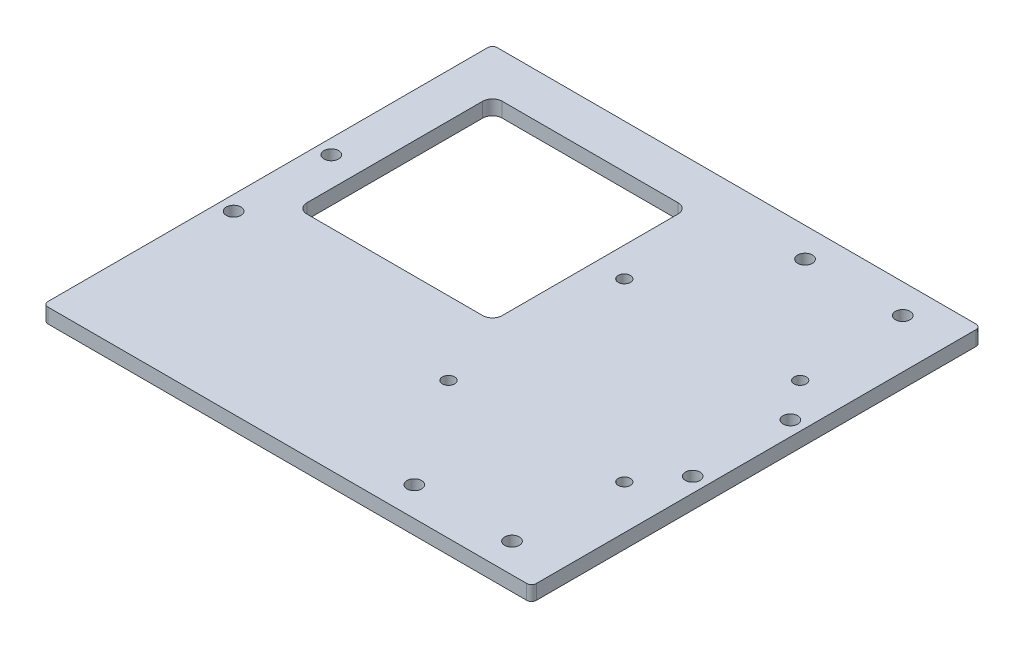
ISO-10303-21;
HEADER;
FILE_DESCRIPTION(('STEP AP214'),'2;1');
FILE_NAME('part.step','',(''),(''),'','','');
FILE_SCHEMA(('AUTOMOTIVE_DESIGN { 1 0 10303 214 1 1 1 1 }'));
ENDSEC;
DATA;
#1=APPLICATION_CONTEXT('core data for automotive mechanical design processes');
#2=APPLICATION_PROTOCOL_DEFINITION('international standard','automotive_design',2000,#1);
#3=PRODUCT_CONTEXT('',#1,'mechanical');
#4=PRODUCT('Part','Part','',(#3));
#5=PRODUCT_RELATED_PRODUCT_CATEGORY('part','',(#4));
#6=PRODUCT_DEFINITION_FORMATION('','',#4);
#7=PRODUCT_DEFINITION_CONTEXT('part definition',#1,'design');
#8=PRODUCT_DEFINITION('design','',#6,#7);
#9=PRODUCT_DEFINITION_SHAPE('','',#8);
#10=(LENGTH_UNIT() NAMED_UNIT(*) SI_UNIT(.MILLI.,.METRE.));
#11=(NAMED_UNIT(*) PLANE_ANGLE_UNIT() SI_UNIT($,.RADIAN.));
#12=(NAMED_UNIT(*) SI_UNIT($,.STERADIAN.) SOLID_ANGLE_UNIT());
#13=UNCERTAINTY_MEASURE_WITH_UNIT(LENGTH_MEASURE(1.E-05),#10,'distance_accuracy_value','');
#14=(GEOMETRIC_REPRESENTATION_CONTEXT(3) GLOBAL_UNCERTAINTY_ASSIGNED_CONTEXT((#13)) GLOBAL_UNIT_ASSIGNED_CONTEXT((#10,
#11,#12)) REPRESENTATION_CONTEXT('',''));
#15=CARTESIAN_POINT('',(0.,0.,0.));
#16=DIRECTION('',(0.,0.,1.));
#17=DIRECTION('',(1.,0.,0.));
#18=AXIS2_PLACEMENT_3D('',#15,#16,#17);
#19=CARTESIAN_POINT('',(0.,3.,0.));
#20=DIRECTION('',(1.,0.,0.));
#21=DIRECTION('',(0.,0.,-1.));
#22=AXIS2_PLACEMENT_3D('',#19,#20,#21);
#23=PLANE('',#22);
#24=DIRECTION('',(0.,0.,1.));
#25=VECTOR('',#24,1.);
#26=CARTESIAN_POINT('',(0.,0.,0.));
#27=LINE('',#26,#25);
#28=CARTESIAN_POINT('',(0.,0.,-91.));
#29=VERTEX_POINT('',#28);
#30=CARTESIAN_POINT('',(0.,0.,-1.));
#31=VERTEX_POINT('',#30);
#32=EDGE_CURVE('E247',#29,#31,#27,.T.);
#33=ORIENTED_EDGE('',*,*,#32,.T.);
#34=DIRECTION('',(0.,-1.,0.));
#35=VECTOR('',#34,1.);
#36=CARTESIAN_POINT('',(0.,3.,-1.));
#37=LINE('',#36,#35);
#38=CARTESIAN_POINT('',(0.,3.,-1.));
#39=VERTEX_POINT('',#38);
#40=EDGE_CURVE('E11',#31,#39,#37,.F.);
#41=ORIENTED_EDGE('',*,*,#40,.T.);
#42=DIRECTION('',(0.,0.,1.));
#43=VECTOR('',#42,1.);
#44=CARTESIAN_POINT('',(0.,3.,0.));
#45=LINE('',#44,#43);
#46=CARTESIAN_POINT('',(0.,3.,-91.));
#47=VERTEX_POINT('',#46);
#48=EDGE_CURVE('E249',#47,#39,#45,.T.);
#49=ORIENTED_EDGE('',*,*,#48,.F.);
#50=DIRECTION('',(0.,-1.,0.));
#51=VECTOR('',#50,1.);
#52=CARTESIAN_POINT('',(0.,3.,-91.));
#53=LINE('',#52,#51);
#54=EDGE_CURVE('E50',#47,#29,#53,.T.);
#55=ORIENTED_EDGE('',*,*,#54,.T.);
#56=EDGE_LOOP('',(#33,#41,#49,#55));
#57=FACE_BOUND('',#56,.T.);
#58=ADVANCED_FACE('F39',(#57),#23,.F.);
#59=CARTESIAN_POINT('',(0.,3.,0.));
#60=DIRECTION('',(0.,0.,-1.));
#61=DIRECTION('',(-1.,0.,0.));
#62=AXIS2_PLACEMENT_3D('',#59,#60,#61);
#63=PLANE('',#62);
#64=DIRECTION('',(1.,0.,0.));
#65=VECTOR('',#64,1.);
#66=CARTESIAN_POINT('',(0.,0.,0.));
#67=LINE('',#66,#65);
#68=CARTESIAN_POINT('',(1.,0.,0.));
#69=VERTEX_POINT('',#68);
#70=CARTESIAN_POINT('',(99.,0.,0.));
#71=VERTEX_POINT('',#70);
#72=EDGE_CURVE('E260',#69,#71,#67,.T.);
#73=ORIENTED_EDGE('',*,*,#72,.T.);
#74=DIRECTION('',(0.,-1.,0.));
#75=VECTOR('',#74,1.);
#76=CARTESIAN_POINT('',(99.,3.,0.));
#77=LINE('',#76,#75);
#78=CARTESIAN_POINT('',(99.,3.,0.));
#79=VERTEX_POINT('',#78);
#80=EDGE_CURVE('E53',#71,#79,#77,.F.);
#81=ORIENTED_EDGE('',*,*,#80,.T.);
#82=DIRECTION('',(1.,0.,0.));
#83=VECTOR('',#82,1.);
#84=CARTESIAN_POINT('',(0.,3.,0.));
#85=LINE('',#84,#83);
#86=CARTESIAN_POINT('',(1.,3.,0.));
#87=VERTEX_POINT('',#86);
#88=EDGE_CURVE('E347',#87,#79,#85,.T.);
#89=ORIENTED_EDGE('',*,*,#88,.F.);
#90=DIRECTION('',(0.,-1.,0.));
#91=VECTOR('',#90,1.);
#92=CARTESIAN_POINT('',(1.,3.,0.));
#93=LINE('',#92,#91);
#94=EDGE_CURVE('E237',#87,#69,#93,.T.);
#95=ORIENTED_EDGE('',*,*,#94,.T.);
#96=EDGE_LOOP('',(#73,#81,#89,#95));
#97=FACE_BOUND('',#96,.T.);
#98=ADVANCED_FACE('F382',(#97),#63,.F.);
#99=CARTESIAN_POINT('',(100.,3.,0.));
#100=DIRECTION('',(-1.,0.,0.));
#101=DIRECTION('',(0.,0.,1.));
#102=AXIS2_PLACEMENT_3D('',#99,#100,#101);
#103=PLANE('',#102);
#104=DIRECTION('',(0.,0.,-1.));
#105=VECTOR('',#104,1.);
#106=CARTESIAN_POINT('',(100.,0.,0.));
#107=LINE('',#106,#105);
#108=CARTESIAN_POINT('',(100.,0.,-1.));
#109=VERTEX_POINT('',#108);
#110=CARTESIAN_POINT('',(100.,0.,-91.));
#111=VERTEX_POINT('',#110);
#112=EDGE_CURVE('E264',#109,#111,#107,.T.);
#113=ORIENTED_EDGE('',*,*,#112,.T.);
#114=DIRECTION('',(0.,-1.,0.));
#115=VECTOR('',#114,1.);
#116=CARTESIAN_POINT('',(100.,3.,-91.));
#117=LINE('',#116,#115);
#118=CARTESIAN_POINT('',(100.,3.,-91.));
#119=VERTEX_POINT('',#118);
#120=EDGE_CURVE('E229',#111,#119,#117,.F.);
#121=ORIENTED_EDGE('',*,*,#120,.T.);
#122=DIRECTION('',(0.,0.,-1.));
#123=VECTOR('',#122,1.);
#124=CARTESIAN_POINT('',(100.,3.,0.));
#125=LINE('',#124,#123);
#126=CARTESIAN_POINT('',(100.,3.,-1.));
#127=VERTEX_POINT('',#126);
#128=EDGE_CURVE('E352',#127,#119,#125,.T.);
#129=ORIENTED_EDGE('',*,*,#128,.F.);
#130=DIRECTION('',(0.,-1.,0.));
#131=VECTOR('',#130,1.);
#132=CARTESIAN_POINT('',(100.,3.,-1.));
#133=LINE('',#132,#131);
#134=EDGE_CURVE('E227',#127,#109,#133,.T.);
#135=ORIENTED_EDGE('',*,*,#134,.T.);
#136=EDGE_LOOP('',(#113,#121,#129,#135));
#137=FACE_BOUND('',#136,.T.);
#138=ADVANCED_FACE('F362',(#137),#103,.F.);
#139=CARTESIAN_POINT('',(0.,3.,-92.));
#140=DIRECTION('',(0.,0.,1.));
#141=DIRECTION('',(1.,0.,0.));
#142=AXIS2_PLACEMENT_3D('',#139,#140,#141);
#143=PLANE('',#142);
#144=DIRECTION('',(-1.,0.,0.));
#145=VECTOR('',#144,1.);
#146=CARTESIAN_POINT('',(0.,3.,-92.));
#147=LINE('',#146,#145);
#148=CARTESIAN_POINT('',(99.,3.,-92.));
#149=VERTEX_POINT('',#148);
#150=CARTESIAN_POINT('',(1.,3.,-92.));
#151=VERTEX_POINT('',#150);
#152=EDGE_CURVE('E269',#149,#151,#147,.T.);
#153=ORIENTED_EDGE('',*,*,#152,.F.);
#154=DIRECTION('',(0.,-1.,0.));
#155=VECTOR('',#154,1.);
#156=CARTESIAN_POINT('',(99.,3.,-92.));
#157=LINE('',#156,#155);
#158=CARTESIAN_POINT('',(99.,0.,-92.));
#159=VERTEX_POINT('',#158);
#160=EDGE_CURVE('E219',#149,#159,#157,.T.);
#161=ORIENTED_EDGE('',*,*,#160,.T.);
#162=DIRECTION('',(-1.,0.,0.));
#163=VECTOR('',#162,1.);
#164=CARTESIAN_POINT('',(0.,0.,-92.));
#165=LINE('',#164,#163);
#166=CARTESIAN_POINT('',(1.,0.,-92.));
#167=VERTEX_POINT('',#166);
#168=EDGE_CURVE('E275',#159,#167,#165,.T.);
#169=ORIENTED_EDGE('',*,*,#168,.T.);
#170=DIRECTION('',(0.,-1.,0.));
#171=VECTOR('',#170,1.);
#172=CARTESIAN_POINT('',(1.,3.,-92.));
#173=LINE('',#172,#171);
#174=EDGE_CURVE('E213',#167,#151,#173,.F.);
#175=ORIENTED_EDGE('',*,*,#174,.T.);
#176=EDGE_LOOP('',(#153,#161,#169,#175));
#177=FACE_BOUND('',#176,.T.);
#178=ADVANCED_FACE('F359',(#177),#143,.F.);
#179=CARTESIAN_POINT('',(0.,3.,0.));
#180=DIRECTION('',(0.,-1.,0.));
#181=DIRECTION('',(0.,0.,-1.));
#182=AXIS2_PLACEMENT_3D('',#179,#180,#181);
#183=PLANE('',#182);
#184=CARTESIAN_POINT('',(91.,3.,-28.));
#185=DIRECTION('',(0.,-1.,0.));
#186=DIRECTION('',(0.,0.,-1.));
#187=AXIS2_PLACEMENT_3D('',#184,#185,#186);
#188=CIRCLE('',#187,1.25);
#189=CARTESIAN_POINT('',(91.,3.,-29.25));
#190=VERTEX_POINT('',#189);
#191=EDGE_CURVE('E294',#190,#190,#188,.T.);
#192=ORIENTED_EDGE('',*,*,#191,.T.);
#193=EDGE_LOOP('',(#192));
#194=FACE_BOUND('',#193,.T.);
#195=CARTESIAN_POINT('',(55.,3.,-64.));
#196=DIRECTION('',(0.,-1.,0.));
#197=DIRECTION('',(0.,0.,-1.));
#198=AXIS2_PLACEMENT_3D('',#195,#196,#197);
#199=CIRCLE('',#198,1.25);
#200=CARTESIAN_POINT('',(55.,3.,-65.25));
#201=VERTEX_POINT('',#200);
#202=EDGE_CURVE('E297',#201,#201,#199,.T.);
#203=ORIENTED_EDGE('',*,*,#202,.T.);
#204=EDGE_LOOP('',(#203));
#205=FACE_BOUND('',#204,.T.);
#206=CARTESIAN_POINT('',(91.,3.,-64.));
#207=DIRECTION('',(0.,-1.,0.));
#208=DIRECTION('',(0.,0.,-1.));
#209=AXIS2_PLACEMENT_3D('',#206,#207,#208);
#210=CIRCLE('',#209,1.25);
#211=CARTESIAN_POINT('',(91.,3.,-65.25));
#212=VERTEX_POINT('',#211);
#213=EDGE_CURVE('E661',#212,#212,#210,.T.);
#214=ORIENTED_EDGE('',*,*,#213,.T.);
#215=EDGE_LOOP('',(#214));
#216=FACE_BOUND('',#215,.T.);
#217=CARTESIAN_POINT('',(55.,3.,-28.));
#218=DIRECTION('',(0.,-1.,0.));
#219=DIRECTION('',(0.,0.,-1.));
#220=AXIS2_PLACEMENT_3D('',#217,#218,#219);
#221=CIRCLE('',#220,1.25);
#222=CARTESIAN_POINT('',(55.,3.,-29.25));
#223=VERTEX_POINT('',#222);
#224=EDGE_CURVE('E658',#223,#223,#221,.T.);
#225=ORIENTED_EDGE('',*,*,#224,.T.);
#226=EDGE_LOOP('',(#225));
#227=FACE_BOUND('',#226,.T.);
#228=DIRECTION('',(0.,0.,-1.));
#229=VECTOR('',#228,1.);
#230=CARTESIAN_POINT('',(49.,3.,0.));
#231=LINE('',#230,#229);
#232=CARTESIAN_POINT('',(49.,3.,-45.));
#233=VERTEX_POINT('',#232);
#234=CARTESIAN_POINT('',(49.,3.,-81.));
#235=VERTEX_POINT('',#234);
#236=EDGE_CURVE('E176',#233,#235,#231,.T.);
#237=ORIENTED_EDGE('',*,*,#236,.F.);
#238=CARTESIAN_POINT('',(47.,3.,-45.));
#239=DIRECTION('',(0.,-1.,0.));
#240=DIRECTION('',(0.,0.,-1.));
#241=AXIS2_PLACEMENT_3D('',#238,#239,#240);
#242=CIRCLE('',#241,2.);
#243=CARTESIAN_POINT('',(47.,3.,-43.));
#244=VERTEX_POINT('',#243);
#245=EDGE_CURVE('E207',#233,#244,#242,.T.);
#246=ORIENTED_EDGE('',*,*,#245,.T.);
#247=DIRECTION('',(1.,0.,0.));
#248=VECTOR('',#247,1.);
#249=CARTESIAN_POINT('',(0.,3.,-43.));
#250=LINE('',#249,#248);
#251=CARTESIAN_POINT('',(11.,3.,-43.));
#252=VERTEX_POINT('',#251);
#253=EDGE_CURVE('E291',#252,#244,#250,.T.);
#254=ORIENTED_EDGE('',*,*,#253,.F.);
#255=CARTESIAN_POINT('',(11.,3.,-45.));
#256=DIRECTION('',(0.,-1.,0.));
#257=DIRECTION('',(0.,0.,-1.));
#258=AXIS2_PLACEMENT_3D('',#255,#256,#257);
#259=CIRCLE('',#258,2.);
#260=CARTESIAN_POINT('',(9.,3.,-45.));
#261=VERTEX_POINT('',#260);
#262=EDGE_CURVE('E208',#252,#261,#259,.T.);
#263=ORIENTED_EDGE('',*,*,#262,.T.);
#264=DIRECTION('',(0.,0.,-1.));
#265=VECTOR('',#264,1.);
#266=CARTESIAN_POINT('',(9.,3.,0.));
#267=LINE('',#266,#265);
#268=CARTESIAN_POINT('',(9.,3.,-81.));
#269=VERTEX_POINT('',#268);
#270=EDGE_CURVE('E158',#261,#269,#267,.T.);
#271=ORIENTED_EDGE('',*,*,#270,.T.);
#272=CARTESIAN_POINT('',(11.,3.,-81.));
#273=DIRECTION('',(0.,-1.,0.));
#274=DIRECTION('',(0.,0.,-1.));
#275=AXIS2_PLACEMENT_3D('',#272,#273,#274);
#276=CIRCLE('',#275,2.);
#277=CARTESIAN_POINT('',(11.,3.,-83.));
#278=VERTEX_POINT('',#277);
#279=EDGE_CURVE('E155',#269,#278,#276,.T.);
#280=ORIENTED_EDGE('',*,*,#279,.T.);
#281=DIRECTION('',(1.,0.,0.));
#282=VECTOR('',#281,1.);
#283=CARTESIAN_POINT('',(0.,3.,-83.));
#284=LINE('',#283,#282);
#285=CARTESIAN_POINT('',(47.,3.,-83.));
#286=VERTEX_POINT('',#285);
#287=EDGE_CURVE('E160',#278,#286,#284,.T.);
#288=ORIENTED_EDGE('',*,*,#287,.T.);
#289=CARTESIAN_POINT('',(47.,3.,-81.));
#290=DIRECTION('',(0.,-1.,0.));
#291=DIRECTION('',(0.,0.,-1.));
#292=AXIS2_PLACEMENT_3D('',#289,#290,#291);
#293=CIRCLE('',#292,2.);
#294=EDGE_CURVE('E204',#286,#235,#293,.T.);
#295=ORIENTED_EDGE('',*,*,#294,.T.);
#296=EDGE_LOOP('',(#237,#246,#254,#263,#271,#280,#288,#295));
#297=FACE_BOUND('',#296,.T.);
#298=CARTESIAN_POINT('',(97.,3.,-56.));
#299=DIRECTION('',(0.,1.,0.));
#300=DIRECTION('',(0.,0.,1.));
#301=AXIS2_PLACEMENT_3D('',#298,#299,#300);
#302=CIRCLE('',#301,1.5);
#303=CARTESIAN_POINT('',(97.,3.,-54.5));
#304=VERTEX_POINT('',#303);
#305=EDGE_CURVE('E332',#304,#304,#302,.T.);
#306=ORIENTED_EDGE('',*,*,#305,.F.);
#307=EDGE_LOOP('',(#306));
#308=FACE_BOUND('',#307,.T.);
#309=CARTESIAN_POINT('',(90.0000000000001,3.,-5.99999999999998));
#310=DIRECTION('',(0.,1.,0.));
#311=DIRECTION('',(0.,0.,1.));
#312=AXIS2_PLACEMENT_3D('',#309,#310,#311);
#313=CIRCLE('',#312,1.5);
#314=CARTESIAN_POINT('',(90.0000000000001,3.,-4.49999999999998));
#315=VERTEX_POINT('',#314);
#316=EDGE_CURVE('E323',#315,#315,#313,.T.);
#317=ORIENTED_EDGE('',*,*,#316,.F.);
#318=EDGE_LOOP('',(#317));
#319=FACE_BOUND('',#318,.T.);
#320=CARTESIAN_POINT('',(70.,3.,-5.99999999999998));
#321=DIRECTION('',(0.,1.,0.));
#322=DIRECTION('',(0.,0.,1.));
#323=AXIS2_PLACEMENT_3D('',#320,#321,#322);
#324=CIRCLE('',#323,1.5);
#325=CARTESIAN_POINT('',(70.,3.,-4.49999999999998));
#326=VERTEX_POINT('',#325);
#327=EDGE_CURVE('E341',#326,#326,#324,.T.);
#328=ORIENTED_EDGE('',*,*,#327,.F.);
#329=EDGE_LOOP('',(#328));
#330=FACE_BOUND('',#329,.T.);
#331=CARTESIAN_POINT('',(90.,3.,-86.));
#332=DIRECTION('',(0.,1.,0.));
#333=DIRECTION('',(0.,0.,1.));
#334=AXIS2_PLACEMENT_3D('',#331,#332,#333);
#335=CIRCLE('',#334,1.5);
#336=CARTESIAN_POINT('',(90.,3.,-84.5));
#337=VERTEX_POINT('',#336);
#338=EDGE_CURVE('E337',#337,#337,#335,.T.);
#339=ORIENTED_EDGE('',*,*,#338,.F.);
#340=EDGE_LOOP('',(#339));
#341=FACE_BOUND('',#340,.T.);
#342=CARTESIAN_POINT('',(97.,3.,-36.));
#343=DIRECTION('',(0.,1.,0.));
#344=DIRECTION('',(0.,0.,1.));
#345=AXIS2_PLACEMENT_3D('',#342,#343,#344);
#346=CIRCLE('',#345,1.5);
#347=CARTESIAN_POINT('',(97.,3.,-34.5));
#348=VERTEX_POINT('',#347);
#349=EDGE_CURVE('E306',#348,#348,#346,.T.);
#350=ORIENTED_EDGE('',*,*,#349,.F.);
#351=EDGE_LOOP('',(#350));
#352=FACE_BOUND('',#351,.T.);
#353=CARTESIAN_POINT('',(2.99999999999999,3.,-36.));
#354=DIRECTION('',(0.,1.,0.));
#355=DIRECTION('',(0.,0.,-1.));
#356=AXIS2_PLACEMENT_3D('',#353,#354,#355);
#357=CIRCLE('',#356,1.5);
#358=CARTESIAN_POINT('',(2.99999999999999,3.,-37.5));
#359=VERTEX_POINT('',#358);
#360=EDGE_CURVE('E312',#359,#359,#357,.T.);
#361=ORIENTED_EDGE('',*,*,#360,.F.);
#362=EDGE_LOOP('',(#361));
#363=FACE_BOUND('',#362,.T.);
#364=CARTESIAN_POINT('',(2.99999999999999,3.,-56.));
#365=DIRECTION('',(0.,1.,0.));
#366=DIRECTION('',(0.,0.,-1.));
#367=AXIS2_PLACEMENT_3D('',#364,#365,#366);
#368=CIRCLE('',#367,1.5);
#369=CARTESIAN_POINT('',(2.99999999999999,3.,-57.5));
#370=VERTEX_POINT('',#369);
#371=EDGE_CURVE('E316',#370,#370,#368,.T.);
#372=ORIENTED_EDGE('',*,*,#371,.F.);
#373=EDGE_LOOP('',(#372));
#374=FACE_BOUND('',#373,.T.);
#375=CARTESIAN_POINT('',(70.,3.,-86.));
#376=DIRECTION('',(0.,1.,0.));
#377=DIRECTION('',(0.,0.,1.));
#378=AXIS2_PLACEMENT_3D('',#375,#376,#377);
#379=CIRCLE('',#378,1.5);
#380=CARTESIAN_POINT('',(70.,3.,-84.5));
#381=VERTEX_POINT('',#380);
#382=EDGE_CURVE('E263',#381,#381,#379,.T.);
#383=ORIENTED_EDGE('',*,*,#382,.F.);
#384=EDGE_LOOP('',(#383));
#385=FACE_BOUND('',#384,.T.);
#386=ORIENTED_EDGE('',*,*,#128,.T.);
#387=CARTESIAN_POINT('',(99.,3.,-91.));
#388=DIRECTION('',(0.,-1.,0.));
#389=DIRECTION('',(0.,0.,-1.));
#390=AXIS2_PLACEMENT_3D('',#387,#388,#389);
#391=CIRCLE('',#390,1.);
#392=EDGE_CURVE('E240',#119,#149,#391,.F.);
#393=ORIENTED_EDGE('',*,*,#392,.T.);
#394=ORIENTED_EDGE('',*,*,#152,.T.);
#395=CARTESIAN_POINT('',(1.,3.,-91.));
#396=DIRECTION('',(0.,-1.,0.));
#397=DIRECTION('',(0.,0.,-1.));
#398=AXIS2_PLACEMENT_3D('',#395,#396,#397);
#399=CIRCLE('',#398,1.);
#400=EDGE_CURVE('E235',#151,#47,#399,.F.);
#401=ORIENTED_EDGE('',*,*,#400,.T.);
#402=ORIENTED_EDGE('',*,*,#48,.T.);
#403=CARTESIAN_POINT('',(1.,3.,-1.));
#404=DIRECTION('',(0.,-1.,0.));
#405=DIRECTION('',(0.,0.,-1.));
#406=AXIS2_PLACEMENT_3D('',#403,#404,#405);
#407=CIRCLE('',#406,1.);
#408=EDGE_CURVE('E64',#39,#87,#407,.F.);
#409=ORIENTED_EDGE('',*,*,#408,.T.);
#410=ORIENTED_EDGE('',*,*,#88,.T.);
#411=CARTESIAN_POINT('',(99.,3.,-1.));
#412=DIRECTION('',(0.,-1.,0.));
#413=DIRECTION('',(0.,0.,-1.));
#414=AXIS2_PLACEMENT_3D('',#411,#412,#413);
#415=CIRCLE('',#414,1.);
#416=EDGE_CURVE('E232',#79,#127,#415,.F.);
#417=ORIENTED_EDGE('',*,*,#416,.T.);
#418=EDGE_LOOP('',(#386,#393,#394,#401,#402,#409,#410,#417));
#419=FACE_BOUND('',#418,.T.);
#420=ADVANCED_FACE('F157',(#194,#205,#216,#227,#297,#308,#319,#330,#341,#352,#363,#374,#385,
#419),#183,.F.);
#421=CARTESIAN_POINT('',(0.,0.,0.));
#422=DIRECTION('',(0.,-1.,0.));
#423=DIRECTION('',(0.,0.,-1.));
#424=AXIS2_PLACEMENT_3D('',#421,#422,#423);
#425=PLANE('',#424);
#426=CARTESIAN_POINT('',(91.,0.,-28.));
#427=DIRECTION('',(0.,-1.,0.));
#428=DIRECTION('',(0.,0.,-1.));
#429=AXIS2_PLACEMENT_3D('',#426,#427,#428);
#430=CIRCLE('',#429,1.25);
#431=CARTESIAN_POINT('',(91.,0.,-29.25));
#432=VERTEX_POINT('',#431);
#433=EDGE_CURVE('E650',#432,#432,#430,.T.);
#434=ORIENTED_EDGE('',*,*,#433,.F.);
#435=EDGE_LOOP('',(#434));
#436=FACE_BOUND('',#435,.T.);
#437=CARTESIAN_POINT('',(55.,0.,-64.));
#438=DIRECTION('',(0.,-1.,0.));
#439=DIRECTION('',(0.,0.,-1.));
#440=AXIS2_PLACEMENT_3D('',#437,#438,#439);
#441=CIRCLE('',#440,1.25);
#442=CARTESIAN_POINT('',(55.,0.,-65.25));
#443=VERTEX_POINT('',#442);
#444=EDGE_CURVE('E651',#443,#443,#441,.T.);
#445=ORIENTED_EDGE('',*,*,#444,.F.);
#446=EDGE_LOOP('',(#445));
#447=FACE_BOUND('',#446,.T.);
#448=CARTESIAN_POINT('',(91.,0.,-64.));
#449=DIRECTION('',(0.,-1.,0.));
#450=DIRECTION('',(0.,0.,-1.));
#451=AXIS2_PLACEMENT_3D('',#448,#449,#450);
#452=CIRCLE('',#451,1.25);
#453=CARTESIAN_POINT('',(91.,0.,-65.25));
#454=VERTEX_POINT('',#453);
#455=EDGE_CURVE('E657',#454,#454,#452,.T.);
#456=ORIENTED_EDGE('',*,*,#455,.F.);
#457=EDGE_LOOP('',(#456));
#458=FACE_BOUND('',#457,.T.);
#459=CARTESIAN_POINT('',(55.,0.,-28.));
#460=DIRECTION('',(0.,-1.,0.));
#461=DIRECTION('',(0.,0.,-1.));
#462=AXIS2_PLACEMENT_3D('',#459,#460,#461);
#463=CIRCLE('',#462,1.25);
#464=CARTESIAN_POINT('',(55.,0.,-29.25));
#465=VERTEX_POINT('',#464);
#466=EDGE_CURVE('E656',#465,#465,#463,.T.);
#467=ORIENTED_EDGE('',*,*,#466,.F.);
#468=EDGE_LOOP('',(#467));
#469=FACE_BOUND('',#468,.T.);
#470=DIRECTION('',(-1.,0.,0.));
#471=VECTOR('',#470,1.);
#472=CARTESIAN_POINT('',(0.,0.,-43.));
#473=LINE('',#472,#471);
#474=CARTESIAN_POINT('',(47.,0.,-43.));
#475=VERTEX_POINT('',#474);
#476=CARTESIAN_POINT('',(11.,0.,-43.));
#477=VERTEX_POINT('',#476);
#478=EDGE_CURVE('E179',#475,#477,#473,.T.);
#479=ORIENTED_EDGE('',*,*,#478,.F.);
#480=CARTESIAN_POINT('',(47.,0.,-45.));
#481=DIRECTION('',(0.,-1.,0.));
#482=DIRECTION('',(0.,0.,-1.));
#483=AXIS2_PLACEMENT_3D('',#480,#481,#482);
#484=CIRCLE('',#483,2.);
#485=CARTESIAN_POINT('',(49.,0.,-45.));
#486=VERTEX_POINT('',#485);
#487=EDGE_CURVE('E206',#475,#486,#484,.F.);
#488=ORIENTED_EDGE('',*,*,#487,.T.);
#489=DIRECTION('',(0.,0.,1.));
#490=VECTOR('',#489,1.);
#491=CARTESIAN_POINT('',(49.,0.,0.));
#492=LINE('',#491,#490);
#493=CARTESIAN_POINT('',(49.,0.,-81.));
#494=VERTEX_POINT('',#493);
#495=EDGE_CURVE('E274',#494,#486,#492,.T.);
#496=ORIENTED_EDGE('',*,*,#495,.F.);
#497=CARTESIAN_POINT('',(47.,0.,-81.));
#498=DIRECTION('',(0.,-1.,0.));
#499=DIRECTION('',(0.,0.,-1.));
#500=AXIS2_PLACEMENT_3D('',#497,#498,#499);
#501=CIRCLE('',#500,2.);
#502=CARTESIAN_POINT('',(47.,0.,-83.));
#503=VERTEX_POINT('',#502);
#504=EDGE_CURVE('E201',#494,#503,#501,.F.);
#505=ORIENTED_EDGE('',*,*,#504,.T.);
#506=DIRECTION('',(-1.,0.,0.));
#507=VECTOR('',#506,1.);
#508=CARTESIAN_POINT('',(0.,0.,-83.));
#509=LINE('',#508,#507);
#510=CARTESIAN_POINT('',(11.,0.,-83.));
#511=VERTEX_POINT('',#510);
#512=EDGE_CURVE('E276',#503,#511,#509,.T.);
#513=ORIENTED_EDGE('',*,*,#512,.T.);
#514=CARTESIAN_POINT('',(11.,0.,-81.));
#515=DIRECTION('',(0.,-1.,0.));
#516=DIRECTION('',(0.,0.,-1.));
#517=AXIS2_PLACEMENT_3D('',#514,#515,#516);
#518=CIRCLE('',#517,2.);
#519=CARTESIAN_POINT('',(9.,0.,-81.));
#520=VERTEX_POINT('',#519);
#521=EDGE_CURVE('E164',#511,#520,#518,.F.);
#522=ORIENTED_EDGE('',*,*,#521,.T.);
#523=DIRECTION('',(0.,0.,1.));
#524=VECTOR('',#523,1.);
#525=CARTESIAN_POINT('',(9.,0.,0.));
#526=LINE('',#525,#524);
#527=CARTESIAN_POINT('',(9.,0.,-45.));
#528=VERTEX_POINT('',#527);
#529=EDGE_CURVE('E184',#520,#528,#526,.T.);
#530=ORIENTED_EDGE('',*,*,#529,.T.);
#531=CARTESIAN_POINT('',(11.,0.,-45.));
#532=DIRECTION('',(0.,-1.,0.));
#533=DIRECTION('',(0.,0.,-1.));
#534=AXIS2_PLACEMENT_3D('',#531,#532,#533);
#535=CIRCLE('',#534,2.);
#536=EDGE_CURVE('E168',#528,#477,#535,.F.);
#537=ORIENTED_EDGE('',*,*,#536,.T.);
#538=EDGE_LOOP('',(#479,#488,#496,#505,#513,#522,#530,#537));
#539=FACE_BOUND('',#538,.T.);
#540=CARTESIAN_POINT('',(97.,0.,-56.));
#541=DIRECTION('',(0.,1.,0.));
#542=DIRECTION('',(0.,0.,1.));
#543=AXIS2_PLACEMENT_3D('',#540,#541,#542);
#544=CIRCLE('',#543,1.5);
#545=CARTESIAN_POINT('',(97.,0.,-54.5));
#546=VERTEX_POINT('',#545);
#547=EDGE_CURVE('E307',#546,#546,#544,.T.);
#548=ORIENTED_EDGE('',*,*,#547,.T.);
#549=EDGE_LOOP('',(#548));
#550=FACE_BOUND('',#549,.T.);
#551=CARTESIAN_POINT('',(90.0000000000001,0.,-5.99999999999998));
#552=DIRECTION('',(0.,1.,0.));
#553=DIRECTION('',(0.,0.,1.));
#554=AXIS2_PLACEMENT_3D('',#551,#552,#553);
#555=CIRCLE('',#554,1.5);
#556=CARTESIAN_POINT('',(90.0000000000001,0.,-4.49999999999998));
#557=VERTEX_POINT('',#556);
#558=EDGE_CURVE('E330',#557,#557,#555,.T.);
#559=ORIENTED_EDGE('',*,*,#558,.T.);
#560=EDGE_LOOP('',(#559));
#561=FACE_BOUND('',#560,.T.);
#562=CARTESIAN_POINT('',(70.,0.,-5.99999999999998));
#563=DIRECTION('',(0.,1.,0.));
#564=DIRECTION('',(0.,0.,1.));
#565=AXIS2_PLACEMENT_3D('',#562,#563,#564);
#566=CIRCLE('',#565,1.5);
#567=CARTESIAN_POINT('',(70.,0.,-4.49999999999998));
#568=VERTEX_POINT('',#567);
#569=EDGE_CURVE('E326',#568,#568,#566,.T.);
#570=ORIENTED_EDGE('',*,*,#569,.T.);
#571=EDGE_LOOP('',(#570));
#572=FACE_BOUND('',#571,.T.);
#573=CARTESIAN_POINT('',(90.,0.,-86.));
#574=DIRECTION('',(0.,1.,0.));
#575=DIRECTION('',(0.,0.,1.));
#576=AXIS2_PLACEMENT_3D('',#573,#574,#575);
#577=CIRCLE('',#576,1.5);
#578=CARTESIAN_POINT('',(90.,0.,-84.5));
#579=VERTEX_POINT('',#578);
#580=EDGE_CURVE('E339',#579,#579,#577,.T.);
#581=ORIENTED_EDGE('',*,*,#580,.T.);
#582=EDGE_LOOP('',(#581));
#583=FACE_BOUND('',#582,.T.);
#584=CARTESIAN_POINT('',(97.,0.,-36.));
#585=DIRECTION('',(0.,1.,0.));
#586=DIRECTION('',(0.,0.,1.));
#587=AXIS2_PLACEMENT_3D('',#584,#585,#586);
#588=CIRCLE('',#587,1.5);
#589=CARTESIAN_POINT('',(97.,0.,-34.5));
#590=VERTEX_POINT('',#589);
#591=EDGE_CURVE('E309',#590,#590,#588,.T.);
#592=ORIENTED_EDGE('',*,*,#591,.T.);
#593=EDGE_LOOP('',(#592));
#594=FACE_BOUND('',#593,.T.);
#595=CARTESIAN_POINT('',(2.99999999999999,0.,-36.));
#596=DIRECTION('',(0.,1.,0.));
#597=DIRECTION('',(0.,0.,-1.));
#598=AXIS2_PLACEMENT_3D('',#595,#596,#597);
#599=CIRCLE('',#598,1.5);
#600=CARTESIAN_POINT('',(2.99999999999999,0.,-37.5));
#601=VERTEX_POINT('',#600);
#602=EDGE_CURVE('E317',#601,#601,#599,.T.);
#603=ORIENTED_EDGE('',*,*,#602,.T.);
#604=EDGE_LOOP('',(#603));
#605=FACE_BOUND('',#604,.T.);
#606=CARTESIAN_POINT('',(2.99999999999999,0.,-56.));
#607=DIRECTION('',(0.,1.,0.));
#608=DIRECTION('',(0.,0.,-1.));
#609=AXIS2_PLACEMENT_3D('',#606,#607,#608);
#610=CIRCLE('',#609,1.5);
#611=CARTESIAN_POINT('',(2.99999999999999,0.,-57.5));
#612=VERTEX_POINT('',#611);
#613=EDGE_CURVE('E304',#612,#612,#610,.T.);
#614=ORIENTED_EDGE('',*,*,#613,.T.);
#615=EDGE_LOOP('',(#614));
#616=FACE_BOUND('',#615,.T.);
#617=CARTESIAN_POINT('',(70.,0.,-86.));
#618=DIRECTION('',(0.,1.,0.));
#619=DIRECTION('',(0.,0.,1.));
#620=AXIS2_PLACEMENT_3D('',#617,#618,#619);
#621=CIRCLE('',#620,1.5);
#622=CARTESIAN_POINT('',(70.,0.,-84.5));
#623=VERTEX_POINT('',#622);
#624=EDGE_CURVE('E258',#623,#623,#621,.T.);
#625=ORIENTED_EDGE('',*,*,#624,.T.);
#626=EDGE_LOOP('',(#625));
#627=FACE_BOUND('',#626,.T.);
#628=ORIENTED_EDGE('',*,*,#168,.F.);
#629=CARTESIAN_POINT('',(99.,0.,-91.));
#630=DIRECTION('',(0.,-1.,0.));
#631=DIRECTION('',(0.,0.,-1.));
#632=AXIS2_PLACEMENT_3D('',#629,#630,#631);
#633=CIRCLE('',#632,1.);
#634=EDGE_CURVE('E223',#159,#111,#633,.T.);
#635=ORIENTED_EDGE('',*,*,#634,.T.);
#636=ORIENTED_EDGE('',*,*,#112,.F.);
#637=CARTESIAN_POINT('',(99.,0.,-1.));
#638=DIRECTION('',(0.,-1.,0.));
#639=DIRECTION('',(0.,0.,-1.));
#640=AXIS2_PLACEMENT_3D('',#637,#638,#639);
#641=CIRCLE('',#640,1.);
#642=EDGE_CURVE('E225',#109,#71,#641,.T.);
#643=ORIENTED_EDGE('',*,*,#642,.T.);
#644=ORIENTED_EDGE('',*,*,#72,.F.);
#645=CARTESIAN_POINT('',(1.,0.,-1.));
#646=DIRECTION('',(0.,-1.,0.));
#647=DIRECTION('',(0.,0.,-1.));
#648=AXIS2_PLACEMENT_3D('',#645,#646,#647);
#649=CIRCLE('',#648,1.);
#650=EDGE_CURVE('E222',#69,#31,#649,.T.);
#651=ORIENTED_EDGE('',*,*,#650,.T.);
#652=ORIENTED_EDGE('',*,*,#32,.F.);
#653=CARTESIAN_POINT('',(1.,0.,-91.));
#654=DIRECTION('',(0.,-1.,0.));
#655=DIRECTION('',(0.,0.,-1.));
#656=AXIS2_PLACEMENT_3D('',#653,#654,#655);
#657=CIRCLE('',#656,1.);
#658=EDGE_CURVE('E218',#29,#167,#657,.T.);
#659=ORIENTED_EDGE('',*,*,#658,.T.);
#660=EDGE_LOOP('',(#628,#635,#636,#643,#644,#651,#652,#659));
#661=FACE_BOUND('',#660,.T.);
#662=ADVANCED_FACE('F253',(#436,#447,#458,#469,#539,#550,#561,#572,#583,#594,#605,#616,#627,
#661),#425,.T.);
#663=CARTESIAN_POINT('',(70.,0.,-86.));
#664=DIRECTION('',(0.,1.,0.));
#665=DIRECTION('',(0.,0.,1.));
#666=AXIS2_PLACEMENT_3D('',#663,#664,#665);
#667=CYLINDRICAL_SURFACE('',#666,1.5);
#668=ORIENTED_EDGE('',*,*,#624,.F.);
#669=EDGE_LOOP('',(#668));
#670=FACE_BOUND('',#669,.T.);
#671=ORIENTED_EDGE('',*,*,#382,.T.);
#672=EDGE_LOOP('',(#671));
#673=FACE_BOUND('',#672,.T.);
#674=ADVANCED_FACE('F504',(#670,#673),#667,.F.);
#675=CARTESIAN_POINT('',(2.99999999999999,0.,-56.));
#676=DIRECTION('',(0.,1.,0.));
#677=DIRECTION('',(0.,0.,1.));
#678=AXIS2_PLACEMENT_3D('',#675,#676,#677);
#679=CYLINDRICAL_SURFACE('',#678,1.5);
#680=ORIENTED_EDGE('',*,*,#613,.F.);
#681=EDGE_LOOP('',(#680));
#682=FACE_BOUND('',#681,.T.);
#683=ORIENTED_EDGE('',*,*,#371,.T.);
#684=EDGE_LOOP('',(#683));
#685=FACE_BOUND('',#684,.T.);
#686=ADVANCED_FACE('F501',(#682,#685),#679,.F.);
#687=CARTESIAN_POINT('',(2.99999999999999,0.,-36.));
#688=DIRECTION('',(0.,1.,0.));
#689=DIRECTION('',(0.,0.,1.));
#690=AXIS2_PLACEMENT_3D('',#687,#688,#689);
#691=CYLINDRICAL_SURFACE('',#690,1.5);
#692=ORIENTED_EDGE('',*,*,#602,.F.);
#693=EDGE_LOOP('',(#692));
#694=FACE_BOUND('',#693,.T.);
#695=ORIENTED_EDGE('',*,*,#360,.T.);
#696=EDGE_LOOP('',(#695));
#697=FACE_BOUND('',#696,.T.);
#698=ADVANCED_FACE('F500',(#694,#697),#691,.F.);
#699=CARTESIAN_POINT('',(97.,0.,-36.));
#700=DIRECTION('',(0.,1.,0.));
#701=DIRECTION('',(0.,0.,1.));
#702=AXIS2_PLACEMENT_3D('',#699,#700,#701);
#703=CYLINDRICAL_SURFACE('',#702,1.5);
#704=ORIENTED_EDGE('',*,*,#591,.F.);
#705=EDGE_LOOP('',(#704));
#706=FACE_BOUND('',#705,.T.);
#707=ORIENTED_EDGE('',*,*,#349,.T.);
#708=EDGE_LOOP('',(#707));
#709=FACE_BOUND('',#708,.T.);
#710=ADVANCED_FACE('F491',(#706,#709),#703,.F.);
#711=CARTESIAN_POINT('',(90.,0.,-86.));
#712=DIRECTION('',(0.,1.,0.));
#713=DIRECTION('',(0.,0.,1.));
#714=AXIS2_PLACEMENT_3D('',#711,#712,#713);
#715=CYLINDRICAL_SURFACE('',#714,1.5);
#716=ORIENTED_EDGE('',*,*,#580,.F.);
#717=EDGE_LOOP('',(#716));
#718=FACE_BOUND('',#717,.T.);
#719=ORIENTED_EDGE('',*,*,#338,.T.);
#720=EDGE_LOOP('',(#719));
#721=FACE_BOUND('',#720,.T.);
#722=ADVANCED_FACE('F496',(#718,#721),#715,.F.);
#723=CARTESIAN_POINT('',(70.,0.,-5.99999999999998));
#724=DIRECTION('',(0.,1.,0.));
#725=DIRECTION('',(0.,0.,1.));
#726=AXIS2_PLACEMENT_3D('',#723,#724,#725);
#727=CYLINDRICAL_SURFACE('',#726,1.5);
#728=ORIENTED_EDGE('',*,*,#569,.F.);
#729=EDGE_LOOP('',(#728));
#730=FACE_BOUND('',#729,.T.);
#731=ORIENTED_EDGE('',*,*,#327,.T.);
#732=EDGE_LOOP('',(#731));
#733=FACE_BOUND('',#732,.T.);
#734=ADVANCED_FACE('F509',(#730,#733),#727,.F.);
#735=CARTESIAN_POINT('',(90.0000000000001,0.,-5.99999999999998));
#736=DIRECTION('',(0.,1.,0.));
#737=DIRECTION('',(0.,0.,1.));
#738=AXIS2_PLACEMENT_3D('',#735,#736,#737);
#739=CYLINDRICAL_SURFACE('',#738,1.5);
#740=ORIENTED_EDGE('',*,*,#558,.F.);
#741=EDGE_LOOP('',(#740));
#742=FACE_BOUND('',#741,.T.);
#743=ORIENTED_EDGE('',*,*,#316,.T.);
#744=EDGE_LOOP('',(#743));
#745=FACE_BOUND('',#744,.T.);
#746=ADVANCED_FACE('F510',(#742,#745),#739,.F.);
#747=CARTESIAN_POINT('',(97.,0.,-56.));
#748=DIRECTION('',(0.,1.,0.));
#749=DIRECTION('',(0.,0.,1.));
#750=AXIS2_PLACEMENT_3D('',#747,#748,#749);
#751=CYLINDRICAL_SURFACE('',#750,1.5);
#752=ORIENTED_EDGE('',*,*,#547,.F.);
#753=EDGE_LOOP('',(#752));
#754=FACE_BOUND('',#753,.T.);
#755=ORIENTED_EDGE('',*,*,#305,.T.);
#756=EDGE_LOOP('',(#755));
#757=FACE_BOUND('',#756,.T.);
#758=ADVANCED_FACE('F495',(#754,#757),#751,.F.);
#759=CARTESIAN_POINT('',(0.,-7.,-43.));
#760=DIRECTION('',(0.,0.,1.));
#761=DIRECTION('',(1.,0.,0.));
#762=AXIS2_PLACEMENT_3D('',#759,#760,#761);
#763=PLANE('',#762);
#764=ORIENTED_EDGE('',*,*,#253,.T.);
#765=DIRECTION('',(0.,1.,0.));
#766=VECTOR('',#765,1.);
#767=CARTESIAN_POINT('',(47.,0.,-43.));
#768=LINE('',#767,#766);
#769=EDGE_CURVE('E199',#244,#475,#768,.F.);
#770=ORIENTED_EDGE('',*,*,#769,.T.);
#771=ORIENTED_EDGE('',*,*,#478,.T.);
#772=DIRECTION('',(0.,1.,0.));
#773=VECTOR('',#772,1.);
#774=CARTESIAN_POINT('',(11.,-7.,-43.));
#775=LINE('',#774,#773);
#776=EDGE_CURVE('E195',#477,#252,#775,.T.);
#777=ORIENTED_EDGE('',*,*,#776,.T.);
#778=EDGE_LOOP('',(#764,#770,#771,#777));
#779=FACE_BOUND('',#778,.T.);
#780=ADVANCED_FACE('F292',(#779),#763,.F.);
#781=CARTESIAN_POINT('',(9.,-7.,0.));
#782=DIRECTION('',(1.,0.,0.));
#783=DIRECTION('',(0.,0.,-1.));
#784=AXIS2_PLACEMENT_3D('',#781,#782,#783);
#785=PLANE('',#784);
#786=ORIENTED_EDGE('',*,*,#270,.F.);
#787=DIRECTION('',(0.,1.,0.));
#788=VECTOR('',#787,1.);
#789=CARTESIAN_POINT('',(9.,-7.,-45.));
#790=LINE('',#789,#788);
#791=EDGE_CURVE('E197',#261,#528,#790,.F.);
#792=ORIENTED_EDGE('',*,*,#791,.T.);
#793=ORIENTED_EDGE('',*,*,#529,.F.);
#794=DIRECTION('',(0.,1.,0.));
#795=VECTOR('',#794,1.);
#796=CARTESIAN_POINT('',(9.,3.,-81.));
#797=LINE('',#796,#795);
#798=EDGE_CURVE('E200',#520,#269,#797,.T.);
#799=ORIENTED_EDGE('',*,*,#798,.T.);
#800=EDGE_LOOP('',(#786,#792,#793,#799));
#801=FACE_BOUND('',#800,.T.);
#802=ADVANCED_FACE('F484',(#801),#785,.T.);
#803=CARTESIAN_POINT('',(0.,-7.,-83.));
#804=DIRECTION('',(0.,0.,1.));
#805=DIRECTION('',(1.,0.,0.));
#806=AXIS2_PLACEMENT_3D('',#803,#804,#805);
#807=PLANE('',#806);
#808=ORIENTED_EDGE('',*,*,#512,.F.);
#809=DIRECTION('',(0.,1.,0.));
#810=VECTOR('',#809,1.);
#811=CARTESIAN_POINT('',(47.,-7.,-83.));
#812=LINE('',#811,#810);
#813=EDGE_CURVE('E174',#503,#286,#812,.T.);
#814=ORIENTED_EDGE('',*,*,#813,.T.);
#815=ORIENTED_EDGE('',*,*,#287,.F.);
#816=DIRECTION('',(0.,1.,0.));
#817=VECTOR('',#816,1.);
#818=CARTESIAN_POINT('',(11.,0.,-83.));
#819=LINE('',#818,#817);
#820=EDGE_CURVE('E175',#278,#511,#819,.F.);
#821=ORIENTED_EDGE('',*,*,#820,.T.);
#822=EDGE_LOOP('',(#808,#814,#815,#821));
#823=FACE_BOUND('',#822,.T.);
#824=ADVANCED_FACE('F171',(#823),#807,.T.);
#825=CARTESIAN_POINT('',(49.,-7.,0.));
#826=DIRECTION('',(1.,0.,0.));
#827=DIRECTION('',(0.,0.,-1.));
#828=AXIS2_PLACEMENT_3D('',#825,#826,#827);
#829=PLANE('',#828);
#830=ORIENTED_EDGE('',*,*,#236,.T.);
#831=DIRECTION('',(0.,1.,0.));
#832=VECTOR('',#831,1.);
#833=CARTESIAN_POINT('',(49.,-7.,-81.));
#834=LINE('',#833,#832);
#835=EDGE_CURVE('E194',#235,#494,#834,.F.);
#836=ORIENTED_EDGE('',*,*,#835,.T.);
#837=ORIENTED_EDGE('',*,*,#495,.T.);
#838=DIRECTION('',(0.,1.,0.));
#839=VECTOR('',#838,1.);
#840=CARTESIAN_POINT('',(49.,3.,-45.));
#841=LINE('',#840,#839);
#842=EDGE_CURVE('E185',#486,#233,#841,.T.);
#843=ORIENTED_EDGE('',*,*,#842,.T.);
#844=EDGE_LOOP('',(#830,#836,#837,#843));
#845=FACE_BOUND('',#844,.T.);
#846=ADVANCED_FACE('F395',(#845),#829,.F.);
#847=CARTESIAN_POINT('',(47.,-7.,-81.));
#848=DIRECTION('',(0.,1.,0.));
#849=DIRECTION('',(0.,0.,1.));
#850=AXIS2_PLACEMENT_3D('',#847,#848,#849);
#851=CYLINDRICAL_SURFACE('',#850,2.);
#852=ORIENTED_EDGE('',*,*,#504,.F.);
#853=ORIENTED_EDGE('',*,*,#835,.F.);
#854=ORIENTED_EDGE('',*,*,#294,.F.);
#855=ORIENTED_EDGE('',*,*,#813,.F.);
#856=EDGE_LOOP('',(#852,#853,#854,#855));
#857=FACE_BOUND('',#856,.T.);
#858=ADVANCED_FACE('F388',(#857),#851,.F.);
#859=CARTESIAN_POINT('',(47.,-7.,-45.));
#860=DIRECTION('',(0.,-1.,0.));
#861=DIRECTION('',(0.,0.,-1.));
#862=AXIS2_PLACEMENT_3D('',#859,#860,#861);
#863=CYLINDRICAL_SURFACE('',#862,2.);
#864=ORIENTED_EDGE('',*,*,#487,.F.);
#865=ORIENTED_EDGE('',*,*,#769,.F.);
#866=ORIENTED_EDGE('',*,*,#245,.F.);
#867=ORIENTED_EDGE('',*,*,#842,.F.);
#868=EDGE_LOOP('',(#864,#865,#866,#867));
#869=FACE_BOUND('',#868,.T.);
#870=ADVANCED_FACE('F391',(#869),#863,.F.);
#871=CARTESIAN_POINT('',(11.,-7.,-45.));
#872=DIRECTION('',(0.,1.,0.));
#873=DIRECTION('',(0.,0.,1.));
#874=AXIS2_PLACEMENT_3D('',#871,#872,#873);
#875=CYLINDRICAL_SURFACE('',#874,2.);
#876=ORIENTED_EDGE('',*,*,#536,.F.);
#877=ORIENTED_EDGE('',*,*,#791,.F.);
#878=ORIENTED_EDGE('',*,*,#262,.F.);
#879=ORIENTED_EDGE('',*,*,#776,.F.);
#880=EDGE_LOOP('',(#876,#877,#878,#879));
#881=FACE_BOUND('',#880,.T.);
#882=ADVANCED_FACE('F290',(#881),#875,.F.);
#883=CARTESIAN_POINT('',(11.,-7.,-81.));
#884=DIRECTION('',(0.,-1.,0.));
#885=DIRECTION('',(0.,0.,-1.));
#886=AXIS2_PLACEMENT_3D('',#883,#884,#885);
#887=CYLINDRICAL_SURFACE('',#886,2.);
#888=ORIENTED_EDGE('',*,*,#521,.F.);
#889=ORIENTED_EDGE('',*,*,#820,.F.);
#890=ORIENTED_EDGE('',*,*,#279,.F.);
#891=ORIENTED_EDGE('',*,*,#798,.F.);
#892=EDGE_LOOP('',(#888,#889,#890,#891));
#893=FACE_BOUND('',#892,.T.);
#894=ADVANCED_FACE('F177',(#893),#887,.F.);
#895=CARTESIAN_POINT('',(99.,3.,-91.));
#896=DIRECTION('',(0.,-1.,0.));
#897=DIRECTION('',(0.,0.,-1.));
#898=AXIS2_PLACEMENT_3D('',#895,#896,#897);
#899=CYLINDRICAL_SURFACE('',#898,1.);
#900=ORIENTED_EDGE('',*,*,#392,.F.);
#901=ORIENTED_EDGE('',*,*,#120,.F.);
#902=ORIENTED_EDGE('',*,*,#634,.F.);
#903=ORIENTED_EDGE('',*,*,#160,.F.);
#904=EDGE_LOOP('',(#900,#901,#902,#903));
#905=FACE_BOUND('',#904,.T.);
#906=ADVANCED_FACE('F370',(#905),#899,.T.);
#907=CARTESIAN_POINT('',(99.,3.,-1.));
#908=DIRECTION('',(0.,-1.,0.));
#909=DIRECTION('',(0.,0.,-1.));
#910=AXIS2_PLACEMENT_3D('',#907,#908,#909);
#911=CYLINDRICAL_SURFACE('',#910,1.);
#912=ORIENTED_EDGE('',*,*,#416,.F.);
#913=ORIENTED_EDGE('',*,*,#80,.F.);
#914=ORIENTED_EDGE('',*,*,#642,.F.);
#915=ORIENTED_EDGE('',*,*,#134,.F.);
#916=EDGE_LOOP('',(#912,#913,#914,#915));
#917=FACE_BOUND('',#916,.T.);
#918=ADVANCED_FACE('F367',(#917),#911,.T.);
#919=CARTESIAN_POINT('',(1.,3.,-1.));
#920=DIRECTION('',(0.,-1.,0.));
#921=DIRECTION('',(0.,0.,-1.));
#922=AXIS2_PLACEMENT_3D('',#919,#920,#921);
#923=CYLINDRICAL_SURFACE('',#922,1.);
#924=ORIENTED_EDGE('',*,*,#408,.F.);
#925=ORIENTED_EDGE('',*,*,#40,.F.);
#926=ORIENTED_EDGE('',*,*,#650,.F.);
#927=ORIENTED_EDGE('',*,*,#94,.F.);
#928=EDGE_LOOP('',(#924,#925,#926,#927));
#929=FACE_BOUND('',#928,.T.);
#930=ADVANCED_FACE('F374',(#929),#923,.T.);
#931=CARTESIAN_POINT('',(1.,3.,-91.));
#932=DIRECTION('',(0.,-1.,0.));
#933=DIRECTION('',(0.,0.,-1.));
#934=AXIS2_PLACEMENT_3D('',#931,#932,#933);
#935=CYLINDRICAL_SURFACE('',#934,1.);
#936=ORIENTED_EDGE('',*,*,#400,.F.);
#937=ORIENTED_EDGE('',*,*,#174,.F.);
#938=ORIENTED_EDGE('',*,*,#658,.F.);
#939=ORIENTED_EDGE('',*,*,#54,.F.);
#940=EDGE_LOOP('',(#936,#937,#938,#939));
#941=FACE_BOUND('',#940,.T.);
#942=ADVANCED_FACE('F41',(#941),#935,.T.);
#943=CARTESIAN_POINT('',(55.,10.,-28.));
#944=DIRECTION('',(0.,-1.,0.));
#945=DIRECTION('',(0.,0.,-1.));
#946=AXIS2_PLACEMENT_3D('',#943,#944,#945);
#947=CYLINDRICAL_SURFACE('',#946,1.25);
#948=ORIENTED_EDGE('',*,*,#466,.T.);
#949=EDGE_LOOP('',(#948));
#950=FACE_BOUND('',#949,.T.);
#951=ORIENTED_EDGE('',*,*,#224,.F.);
#952=EDGE_LOOP('',(#951));
#953=FACE_BOUND('',#952,.T.);
#954=ADVANCED_FACE('F436',(#950,#953),#947,.F.);
#955=CARTESIAN_POINT('',(91.,10.,-64.));
#956=DIRECTION('',(0.,-1.,0.));
#957=DIRECTION('',(0.,0.,-1.));
#958=AXIS2_PLACEMENT_3D('',#955,#956,#957);
#959=CYLINDRICAL_SURFACE('',#958,1.25);
#960=ORIENTED_EDGE('',*,*,#455,.T.);
#961=EDGE_LOOP('',(#960));
#962=FACE_BOUND('',#961,.T.);
#963=ORIENTED_EDGE('',*,*,#213,.F.);
#964=EDGE_LOOP('',(#963));
#965=FACE_BOUND('',#964,.T.);
#966=ADVANCED_FACE('F444',(#962,#965),#959,.F.);
#967=CARTESIAN_POINT('',(55.,10.,-64.));
#968=DIRECTION('',(0.,-1.,0.));
#969=DIRECTION('',(0.,0.,-1.));
#970=AXIS2_PLACEMENT_3D('',#967,#968,#969);
#971=CYLINDRICAL_SURFACE('',#970,1.25);
#972=ORIENTED_EDGE('',*,*,#444,.T.);
#973=EDGE_LOOP('',(#972));
#974=FACE_BOUND('',#973,.T.);
#975=ORIENTED_EDGE('',*,*,#202,.F.);
#976=EDGE_LOOP('',(#975));
#977=FACE_BOUND('',#976,.T.);
#978=ADVANCED_FACE('F459',(#974,#977),#971,.F.);
#979=CARTESIAN_POINT('',(91.,10.,-28.));
#980=DIRECTION('',(0.,-1.,0.));
#981=DIRECTION('',(0.,0.,-1.));
#982=AXIS2_PLACEMENT_3D('',#979,#980,#981);
#983=CYLINDRICAL_SURFACE('',#982,1.25);
#984=ORIENTED_EDGE('',*,*,#433,.T.);
#985=EDGE_LOOP('',(#984));
#986=FACE_BOUND('',#985,.T.);
#987=ORIENTED_EDGE('',*,*,#191,.F.);
#988=EDGE_LOOP('',(#987));
#989=FACE_BOUND('',#988,.T.);
#990=ADVANCED_FACE('F467',(#986,#989),#983,.F.);
#991=CLOSED_SHELL('',(#58,#98,#138,#178,#420,#662,#674,#686,#698,#710,#722,#734,#746,#758,#780,
#802,#824,#846,#858,#870,#882,#894,#906,#918,#930,#942,#954,#966,#978,#990));
#992=MANIFOLD_SOLID_BREP('B2',#991);
#993=ADVANCED_BREP_SHAPE_REPRESENTATION('',(#18,#992),#14);
#994=SHAPE_DEFINITION_REPRESENTATION(#9,#993);
ENDSEC;
END-ISO-10303-21;
